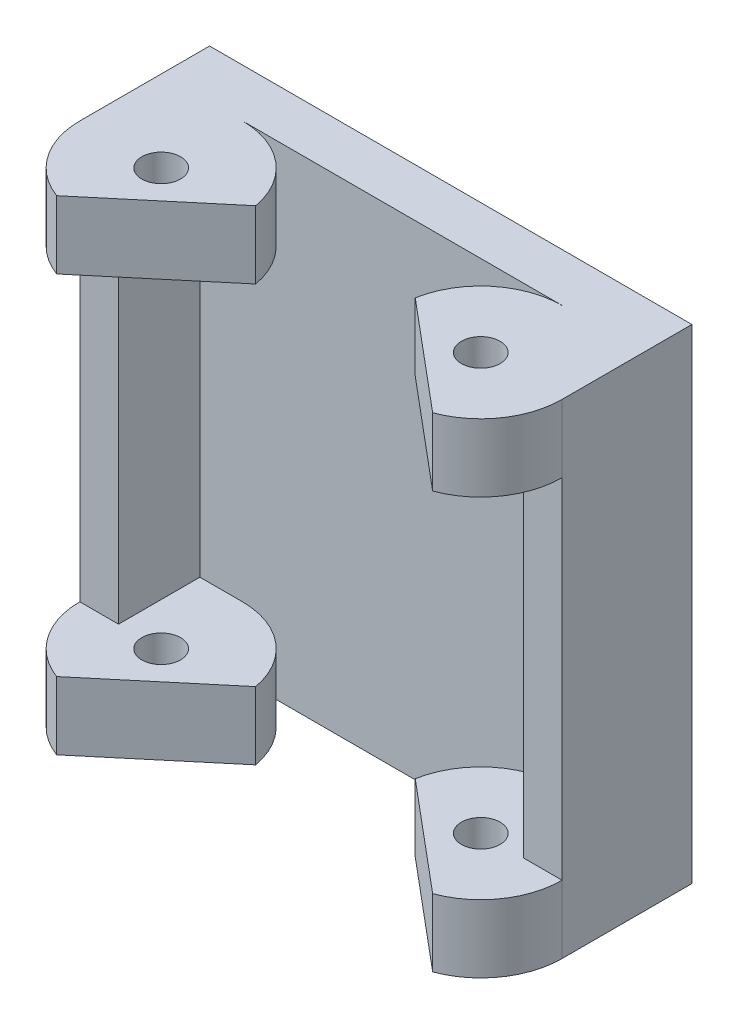
ISO-10303-21;
HEADER;
FILE_DESCRIPTION(('STEP AP214'),'2;1');
FILE_NAME('part.step','',(''),(''),'','','');
FILE_SCHEMA(('AUTOMOTIVE_DESIGN { 1 0 10303 214 1 1 1 1 }'));
ENDSEC;
DATA;
#1=APPLICATION_CONTEXT('core data for automotive mechanical design processes');
#2=APPLICATION_PROTOCOL_DEFINITION('international standard','automotive_design',2000,#1);
#3=PRODUCT_CONTEXT('',#1,'mechanical');
#4=PRODUCT('Part','Part','',(#3));
#5=PRODUCT_RELATED_PRODUCT_CATEGORY('part','',(#4));
#6=PRODUCT_DEFINITION_FORMATION('','',#4);
#7=PRODUCT_DEFINITION_CONTEXT('part definition',#1,'design');
#8=PRODUCT_DEFINITION('design','',#6,#7);
#9=PRODUCT_DEFINITION_SHAPE('','',#8);
#10=(LENGTH_UNIT() NAMED_UNIT(*) SI_UNIT(.MILLI.,.METRE.));
#11=(NAMED_UNIT(*) PLANE_ANGLE_UNIT() SI_UNIT($,.RADIAN.));
#12=(NAMED_UNIT(*) SI_UNIT($,.STERADIAN.) SOLID_ANGLE_UNIT());
#13=UNCERTAINTY_MEASURE_WITH_UNIT(LENGTH_MEASURE(1.E-05),#10,'distance_accuracy_value','');
#14=(GEOMETRIC_REPRESENTATION_CONTEXT(3) GLOBAL_UNCERTAINTY_ASSIGNED_CONTEXT((#13)) GLOBAL_UNIT_ASSIGNED_CONTEXT((#10,
#11,#12)) REPRESENTATION_CONTEXT('',''));
#15=CARTESIAN_POINT('',(0.,0.,0.));
#16=DIRECTION('',(0.,0.,1.));
#17=DIRECTION('',(1.,0.,0.));
#18=AXIS2_PLACEMENT_3D('',#15,#16,#17);
#19=CARTESIAN_POINT('',(-16.5,7.,0.));
#20=DIRECTION('',(0.,-1.,0.));
#21=DIRECTION('',(0.,0.,-1.));
#22=AXIS2_PLACEMENT_3D('',#19,#20,#21);
#23=PLANE('',#22);
#24=CARTESIAN_POINT('',(16.5,7.,0.));
#25=DIRECTION('',(0.,-1.,0.));
#26=DIRECTION('',(0.,0.,-1.));
#27=AXIS2_PLACEMENT_3D('',#24,#25,#26);
#28=CIRCLE('',#27,2.);
#29=CARTESIAN_POINT('',(16.5,7.,-2.));
#30=VERTEX_POINT('',#29);
#31=EDGE_CURVE('E294',#30,#30,#28,.T.);
#32=ORIENTED_EDGE('',*,*,#31,.T.);
#33=EDGE_LOOP('',(#32));
#34=FACE_BOUND('',#33,.T.);
#35=DIRECTION('',(1.,0.,0.));
#36=VECTOR('',#35,1.);
#37=CARTESIAN_POINT('',(20.9,7.,0.));
#38=LINE('',#37,#36);
#39=CARTESIAN_POINT('',(20.9,7.,0.));
#40=VERTEX_POINT('',#39);
#41=CARTESIAN_POINT('',(24.9,7.,0.));
#42=VERTEX_POINT('',#41);
#43=EDGE_CURVE('E240',#40,#42,#38,.T.);
#44=ORIENTED_EDGE('',*,*,#43,.F.);
#45=DIRECTION('',(0.,0.,1.));
#46=VECTOR('',#45,1.);
#47=CARTESIAN_POINT('',(20.9,7.,-8.4));
#48=LINE('',#47,#46);
#49=CARTESIAN_POINT('',(20.9,7.,-8.4));
#50=VERTEX_POINT('',#49);
#51=EDGE_CURVE('E259',#50,#40,#48,.T.);
#52=ORIENTED_EDGE('',*,*,#51,.F.);
#53=DIRECTION('',(1.,0.,0.));
#54=VECTOR('',#53,1.);
#55=CARTESIAN_POINT('',(16.5,7.,-8.4));
#56=LINE('',#55,#54);
#57=CARTESIAN_POINT('',(16.5,7.,-8.4));
#58=VERTEX_POINT('',#57);
#59=EDGE_CURVE('E11',#58,#50,#56,.T.);
#60=ORIENTED_EDGE('',*,*,#59,.F.);
#61=CARTESIAN_POINT('',(16.5,7.,0.));
#62=DIRECTION('',(0.,1.,0.));
#63=DIRECTION('',(0.,0.,1.));
#64=AXIS2_PLACEMENT_3D('',#61,#62,#63);
#65=CIRCLE('',#64,8.4);
#66=CARTESIAN_POINT('',(8.23501361162645,7.,-1.5));
#67=VERTEX_POINT('',#66);
#68=EDGE_CURVE('E317',#58,#67,#65,.T.);
#69=ORIENTED_EDGE('',*,*,#68,.T.);
#70=DIRECTION('',(0.766044443118975,0.,0.642787609686543));
#71=VECTOR('',#70,1.);
#72=CARTESIAN_POINT('',(19.4124114543013,7.,7.87895040731026));
#73=LINE('',#72,#71);
#74=CARTESIAN_POINT('',(19.4124114543013,7.,7.87895040731027));
#75=VERTEX_POINT('',#74);
#76=EDGE_CURVE('E320',#67,#75,#73,.T.);
#77=ORIENTED_EDGE('',*,*,#76,.T.);
#78=CARTESIAN_POINT('',(16.5,7.,0.));
#79=DIRECTION('',(0.,1.,0.));
#80=DIRECTION('',(0.,0.,1.));
#81=AXIS2_PLACEMENT_3D('',#78,#79,#80);
#82=CIRCLE('',#81,8.4);
#83=EDGE_CURVE('E323',#75,#42,#82,.T.);
#84=ORIENTED_EDGE('',*,*,#83,.T.);
#85=EDGE_LOOP('',(#44,#52,#60,#69,#77,#84));
#86=FACE_BOUND('',#85,.T.);
#87=ADVANCED_FACE('F39',(#34,#86),#23,.F.);
#88=CARTESIAN_POINT('',(-16.5,7.,0.));
#89=DIRECTION('',(0.,-1.,0.));
#90=DIRECTION('',(0.,0.,-1.));
#91=AXIS2_PLACEMENT_3D('',#88,#89,#90);
#92=CIRCLE('',#91,2.);
#93=CARTESIAN_POINT('',(-16.5,7.,-2.));
#94=VERTEX_POINT('',#93);
#95=EDGE_CURVE('E301',#94,#94,#92,.T.);
#96=ORIENTED_EDGE('',*,*,#95,.T.);
#97=EDGE_LOOP('',(#96));
#98=FACE_BOUND('',#97,.T.);
#99=CARTESIAN_POINT('',(-20.9,7.,-8.39999999999999));
#100=VERTEX_POINT('',#99);
#101=CARTESIAN_POINT('',(-16.5,7.,-8.4));
#102=VERTEX_POINT('',#101);
#103=EDGE_CURVE('E50',#100,#102,#56,.T.);
#104=ORIENTED_EDGE('',*,*,#103,.F.);
#105=DIRECTION('',(0.,0.,-1.));
#106=VECTOR('',#105,1.);
#107=CARTESIAN_POINT('',(-20.9,7.,-8.39999999999999));
#108=LINE('',#107,#106);
#109=CARTESIAN_POINT('',(-20.9,7.,0.));
#110=VERTEX_POINT('',#109);
#111=EDGE_CURVE('E229',#110,#100,#108,.T.);
#112=ORIENTED_EDGE('',*,*,#111,.F.);
#113=DIRECTION('',(1.,0.,0.));
#114=VECTOR('',#113,1.);
#115=CARTESIAN_POINT('',(-20.9,7.,0.));
#116=LINE('',#115,#114);
#117=CARTESIAN_POINT('',(-24.9,7.,0.));
#118=VERTEX_POINT('',#117);
#119=EDGE_CURVE('E224',#118,#110,#116,.T.);
#120=ORIENTED_EDGE('',*,*,#119,.F.);
#121=CARTESIAN_POINT('',(-16.5,7.,0.));
#122=DIRECTION('',(0.,1.,0.));
#123=DIRECTION('',(0.,0.,-1.));
#124=AXIS2_PLACEMENT_3D('',#121,#122,#123);
#125=CIRCLE('',#124,8.4);
#126=CARTESIAN_POINT('',(-19.4124114543013,7.,7.87895040731027));
#127=VERTEX_POINT('',#126);
#128=EDGE_CURVE('E306',#118,#127,#125,.T.);
#129=ORIENTED_EDGE('',*,*,#128,.T.);
#130=DIRECTION('',(0.766044443118975,0.,-0.642787609686543));
#131=VECTOR('',#130,1.);
#132=CARTESIAN_POINT('',(-19.4124114543013,7.,7.87895040731027));
#133=LINE('',#132,#131);
#134=CARTESIAN_POINT('',(-8.23501361162645,7.,-1.5));
#135=VERTEX_POINT('',#134);
#136=EDGE_CURVE('E310',#127,#135,#133,.T.);
#137=ORIENTED_EDGE('',*,*,#136,.T.);
#138=CARTESIAN_POINT('',(-16.5,7.,0.));
#139=DIRECTION('',(0.,1.,0.));
#140=DIRECTION('',(0.,0.,-1.));
#141=AXIS2_PLACEMENT_3D('',#138,#139,#140);
#142=CIRCLE('',#141,8.4);
#143=EDGE_CURVE('E314',#135,#102,#142,.T.);
#144=ORIENTED_EDGE('',*,*,#143,.T.);
#145=EDGE_LOOP('',(#104,#112,#120,#129,#137,#144));
#146=FACE_BOUND('',#145,.T.);
#147=ADVANCED_FACE('F413',(#98,#146),#23,.F.);
#148=CARTESIAN_POINT('',(-16.5,7.,0.));
#149=DIRECTION('',(0.,-1.,0.));
#150=DIRECTION('',(0.,0.,-1.));
#151=AXIS2_PLACEMENT_3D('',#148,#149,#150);
#152=CYLINDRICAL_SURFACE('',#151,8.4);
#153=CARTESIAN_POINT('',(-16.5,0.,0.));
#154=DIRECTION('',(0.,1.,0.));
#155=DIRECTION('',(0.,0.,-1.));
#156=AXIS2_PLACEMENT_3D('',#153,#154,#155);
#157=CIRCLE('',#156,8.4);
#158=CARTESIAN_POINT('',(-24.9,0.,0.));
#159=VERTEX_POINT('',#158);
#160=CARTESIAN_POINT('',(-19.4124114543013,0.,7.87895040731027));
#161=VERTEX_POINT('',#160);
#162=EDGE_CURVE('E305',#159,#161,#157,.T.);
#163=ORIENTED_EDGE('',*,*,#162,.T.);
#164=DIRECTION('',(0.,-1.,0.));
#165=VECTOR('',#164,1.);
#166=CARTESIAN_POINT('',(-19.4124114543013,7.,7.87895040731027));
#167=LINE('',#166,#165);
#168=EDGE_CURVE('E43',#127,#161,#167,.T.);
#169=ORIENTED_EDGE('',*,*,#168,.F.);
#170=ORIENTED_EDGE('',*,*,#128,.F.);
#171=DIRECTION('',(0.,-1.,0.));
#172=VECTOR('',#171,1.);
#173=CARTESIAN_POINT('',(-24.9,7.,0.));
#174=LINE('',#173,#172);
#175=EDGE_CURVE('E326',#118,#159,#174,.T.);
#176=ORIENTED_EDGE('',*,*,#175,.T.);
#177=EDGE_LOOP('',(#163,#169,#170,#176));
#178=FACE_BOUND('',#177,.T.);
#179=ADVANCED_FACE('F41',(#178),#152,.T.);
#180=CARTESIAN_POINT('',(-19.4124114543013,7.,7.87895040731027));
#181=DIRECTION('',(-0.642787609686543,0.,-0.766044443118975));
#182=DIRECTION('',(-0.766044443118975,0.,0.642787609686543));
#183=AXIS2_PLACEMENT_3D('',#180,#181,#182);
#184=PLANE('',#183);
#185=DIRECTION('',(0.766044443118975,0.,-0.642787609686543));
#186=VECTOR('',#185,1.);
#187=CARTESIAN_POINT('',(-19.4124114543013,0.,7.87895040731027));
#188=LINE('',#187,#186);
#189=CARTESIAN_POINT('',(-8.23501361162645,0.,-1.5));
#190=VERTEX_POINT('',#189);
#191=EDGE_CURVE('E330',#161,#190,#188,.T.);
#192=ORIENTED_EDGE('',*,*,#191,.T.);
#193=DIRECTION('',(0.,-1.,0.));
#194=VECTOR('',#193,1.);
#195=CARTESIAN_POINT('',(-8.23501361162645,7.,-1.5));
#196=LINE('',#195,#194);
#197=EDGE_CURVE('E386',#135,#190,#196,.T.);
#198=ORIENTED_EDGE('',*,*,#197,.F.);
#199=ORIENTED_EDGE('',*,*,#136,.F.);
#200=ORIENTED_EDGE('',*,*,#168,.T.);
#201=EDGE_LOOP('',(#192,#198,#199,#200));
#202=FACE_BOUND('',#201,.T.);
#203=ADVANCED_FACE('F397',(#202),#184,.F.);
#204=CARTESIAN_POINT('',(-16.5,7.,0.));
#205=DIRECTION('',(0.,-1.,0.));
#206=DIRECTION('',(0.,0.,-1.));
#207=AXIS2_PLACEMENT_3D('',#204,#205,#206);
#208=CYLINDRICAL_SURFACE('',#207,8.4);
#209=CARTESIAN_POINT('',(-16.5,0.,0.));
#210=DIRECTION('',(0.,1.,0.));
#211=DIRECTION('',(0.,0.,-1.));
#212=AXIS2_PLACEMENT_3D('',#209,#210,#211);
#213=CIRCLE('',#212,8.4);
#214=CARTESIAN_POINT('',(-16.5,0.,-8.4));
#215=VERTEX_POINT('',#214);
#216=EDGE_CURVE('E333',#190,#215,#213,.T.);
#217=ORIENTED_EDGE('',*,*,#216,.T.);
#218=DIRECTION('',(0.,-1.,0.));
#219=VECTOR('',#218,1.);
#220=CARTESIAN_POINT('',(-16.5,7.,-8.4));
#221=LINE('',#220,#219);
#222=EDGE_CURVE('E383',#102,#215,#221,.T.);
#223=ORIENTED_EDGE('',*,*,#222,.F.);
#224=ORIENTED_EDGE('',*,*,#143,.F.);
#225=ORIENTED_EDGE('',*,*,#197,.T.);
#226=EDGE_LOOP('',(#217,#223,#224,#225));
#227=FACE_BOUND('',#226,.T.);
#228=ADVANCED_FACE('F409',(#227),#208,.T.);
#229=CARTESIAN_POINT('',(16.5,7.,-8.4));
#230=DIRECTION('',(0.,0.,-1.));
#231=DIRECTION('',(-1.,0.,0.));
#232=AXIS2_PLACEMENT_3D('',#229,#230,#231);
#233=PLANE('',#232);
#234=DIRECTION('',(1.,0.,0.));
#235=VECTOR('',#234,1.);
#236=CARTESIAN_POINT('',(16.5,0.,-8.4));
#237=LINE('',#236,#235);
#238=CARTESIAN_POINT('',(16.5,0.,-8.4));
#239=VERTEX_POINT('',#238);
#240=EDGE_CURVE('E336',#215,#239,#237,.T.);
#241=ORIENTED_EDGE('',*,*,#240,.T.);
#242=DIRECTION('',(0.,-1.,0.));
#243=VECTOR('',#242,1.);
#244=CARTESIAN_POINT('',(16.5,7.,-8.4));
#245=LINE('',#244,#243);
#246=EDGE_CURVE('E379',#58,#239,#245,.T.);
#247=ORIENTED_EDGE('',*,*,#246,.F.);
#248=ORIENTED_EDGE('',*,*,#59,.T.);
#249=DIRECTION('',(0.,-1.,0.));
#250=VECTOR('',#249,1.);
#251=CARTESIAN_POINT('',(20.9,43.,-8.4));
#252=LINE('',#251,#250);
#253=CARTESIAN_POINT('',(20.9,43.,-8.4));
#254=VERTEX_POINT('',#253);
#255=EDGE_CURVE('E273',#254,#50,#252,.T.);
#256=ORIENTED_EDGE('',*,*,#255,.F.);
#257=DIRECTION('',(1.,0.,0.));
#258=VECTOR('',#257,1.);
#259=CARTESIAN_POINT('',(-16.5,43.,-8.4));
#260=LINE('',#259,#258);
#261=CARTESIAN_POINT('',(16.5,43.,-8.40000000000004));
#262=VERTEX_POINT('',#261);
#263=EDGE_CURVE('E57',#262,#254,#260,.T.);
#264=ORIENTED_EDGE('',*,*,#263,.F.);
#265=DIRECTION('',(0.,-1.,0.));
#266=VECTOR('',#265,1.);
#267=CARTESIAN_POINT('',(16.5,50.,-8.4));
#268=LINE('',#267,#266);
#269=CARTESIAN_POINT('',(16.5,50.,-8.4));
#270=VERTEX_POINT('',#269);
#271=EDGE_CURVE('E471',#270,#262,#268,.T.);
#272=ORIENTED_EDGE('',*,*,#271,.F.);
#273=DIRECTION('',(1.,0.,0.));
#274=VECTOR('',#273,1.);
#275=CARTESIAN_POINT('',(-16.5,50.,-8.4));
#276=LINE('',#275,#274);
#277=CARTESIAN_POINT('',(-16.5,50.,-8.4));
#278=VERTEX_POINT('',#277);
#279=EDGE_CURVE('E477',#278,#270,#276,.T.);
#280=ORIENTED_EDGE('',*,*,#279,.F.);
#281=DIRECTION('',(0.,-1.,0.));
#282=VECTOR('',#281,1.);
#283=CARTESIAN_POINT('',(-16.5,50.,-8.4));
#284=LINE('',#283,#282);
#285=CARTESIAN_POINT('',(-16.5,43.,-8.4));
#286=VERTEX_POINT('',#285);
#287=EDGE_CURVE('E231',#278,#286,#284,.T.);
#288=ORIENTED_EDGE('',*,*,#287,.T.);
#289=CARTESIAN_POINT('',(-20.9,43.,-8.39999999999999));
#290=VERTEX_POINT('',#289);
#291=EDGE_CURVE('E65',#290,#286,#260,.T.);
#292=ORIENTED_EDGE('',*,*,#291,.F.);
#293=DIRECTION('',(0.,-1.,0.));
#294=VECTOR('',#293,1.);
#295=CARTESIAN_POINT('',(-20.9,43.,-8.39999999999999));
#296=LINE('',#295,#294);
#297=EDGE_CURVE('E277',#290,#100,#296,.T.);
#298=ORIENTED_EDGE('',*,*,#297,.T.);
#299=ORIENTED_EDGE('',*,*,#103,.T.);
#300=ORIENTED_EDGE('',*,*,#222,.T.);
#301=EDGE_LOOP('',(#241,#247,#248,#256,#264,#272,#280,#288,#292,#298,#299,#300));
#302=FACE_BOUND('',#301,.T.);
#303=ADVANCED_FACE('F410',(#302),#233,.F.);
#304=CARTESIAN_POINT('',(16.5,7.,0.));
#305=DIRECTION('',(0.,-1.,0.));
#306=DIRECTION('',(0.,0.,-1.));
#307=AXIS2_PLACEMENT_3D('',#304,#305,#306);
#308=CYLINDRICAL_SURFACE('',#307,8.4);
#309=CARTESIAN_POINT('',(16.5,0.,0.));
#310=DIRECTION('',(0.,1.,0.));
#311=DIRECTION('',(0.,0.,1.));
#312=AXIS2_PLACEMENT_3D('',#309,#310,#311);
#313=CIRCLE('',#312,8.4);
#314=CARTESIAN_POINT('',(8.23501361162645,0.,-1.5));
#315=VERTEX_POINT('',#314);
#316=EDGE_CURVE('E339',#239,#315,#313,.T.);
#317=ORIENTED_EDGE('',*,*,#316,.T.);
#318=DIRECTION('',(0.,-1.,0.));
#319=VECTOR('',#318,1.);
#320=CARTESIAN_POINT('',(8.23501361162645,7.,-1.5));
#321=LINE('',#320,#319);
#322=EDGE_CURVE('E375',#67,#315,#321,.T.);
#323=ORIENTED_EDGE('',*,*,#322,.F.);
#324=ORIENTED_EDGE('',*,*,#68,.F.);
#325=ORIENTED_EDGE('',*,*,#246,.T.);
#326=EDGE_LOOP('',(#317,#323,#324,#325));
#327=FACE_BOUND('',#326,.T.);
#328=ADVANCED_FACE('F529',(#327),#308,.T.);
#329=CARTESIAN_POINT('',(19.4124114543013,7.,7.87895040731026));
#330=DIRECTION('',(0.642787609686543,0.,-0.766044443118975));
#331=DIRECTION('',(-0.766044443118975,0.,-0.642787609686543));
#332=AXIS2_PLACEMENT_3D('',#329,#330,#331);
#333=PLANE('',#332);
#334=DIRECTION('',(0.766044443118975,0.,0.642787609686543));
#335=VECTOR('',#334,1.);
#336=CARTESIAN_POINT('',(19.4124114543013,0.,7.87895040731026));
#337=LINE('',#336,#335);
#338=CARTESIAN_POINT('',(19.4124114543013,0.,7.87895040731027));
#339=VERTEX_POINT('',#338);
#340=EDGE_CURVE('E342',#315,#339,#337,.T.);
#341=ORIENTED_EDGE('',*,*,#340,.T.);
#342=DIRECTION('',(0.,-1.,0.));
#343=VECTOR('',#342,1.);
#344=CARTESIAN_POINT('',(19.4124114543013,7.,7.87895040731027));
#345=LINE('',#344,#343);
#346=EDGE_CURVE('E371',#75,#339,#345,.T.);
#347=ORIENTED_EDGE('',*,*,#346,.F.);
#348=ORIENTED_EDGE('',*,*,#76,.F.);
#349=ORIENTED_EDGE('',*,*,#322,.T.);
#350=EDGE_LOOP('',(#341,#347,#348,#349));
#351=FACE_BOUND('',#350,.T.);
#352=ADVANCED_FACE('F525',(#351),#333,.F.);
#353=CARTESIAN_POINT('',(16.5,7.,0.));
#354=DIRECTION('',(0.,-1.,0.));
#355=DIRECTION('',(0.,0.,-1.));
#356=AXIS2_PLACEMENT_3D('',#353,#354,#355);
#357=CYLINDRICAL_SURFACE('',#356,8.4);
#358=CARTESIAN_POINT('',(16.5,0.,0.));
#359=DIRECTION('',(0.,1.,0.));
#360=DIRECTION('',(0.,0.,1.));
#361=AXIS2_PLACEMENT_3D('',#358,#359,#360);
#362=CIRCLE('',#361,8.4);
#363=CARTESIAN_POINT('',(24.9,0.,0.));
#364=VERTEX_POINT('',#363);
#365=EDGE_CURVE('E345',#339,#364,#362,.T.);
#366=ORIENTED_EDGE('',*,*,#365,.T.);
#367=DIRECTION('',(0.,-1.,0.));
#368=VECTOR('',#367,1.);
#369=CARTESIAN_POINT('',(24.9,7.,0.));
#370=LINE('',#369,#368);
#371=EDGE_CURVE('E367',#42,#364,#370,.T.);
#372=ORIENTED_EDGE('',*,*,#371,.F.);
#373=ORIENTED_EDGE('',*,*,#83,.F.);
#374=ORIENTED_EDGE('',*,*,#346,.T.);
#375=EDGE_LOOP('',(#366,#372,#373,#374));
#376=FACE_BOUND('',#375,.T.);
#377=ADVANCED_FACE('F521',(#376),#357,.T.);
#378=CARTESIAN_POINT('',(24.9,7.,0.));
#379=DIRECTION('',(-1.,0.,0.));
#380=DIRECTION('',(0.,0.,1.));
#381=AXIS2_PLACEMENT_3D('',#378,#379,#380);
#382=PLANE('',#381);
#383=DIRECTION('',(0.,0.,-1.));
#384=VECTOR('',#383,1.);
#385=CARTESIAN_POINT('',(24.9,0.,0.));
#386=LINE('',#385,#384);
#387=CARTESIAN_POINT('',(24.9,0.,-13.4));
#388=VERTEX_POINT('',#387);
#389=EDGE_CURVE('E348',#364,#388,#386,.T.);
#390=ORIENTED_EDGE('',*,*,#389,.T.);
#391=DIRECTION('',(0.,-1.,0.));
#392=VECTOR('',#391,1.);
#393=CARTESIAN_POINT('',(24.9,7.,-13.4));
#394=LINE('',#393,#392);
#395=CARTESIAN_POINT('',(24.9,50.,-13.4));
#396=VERTEX_POINT('',#395);
#397=EDGE_CURVE('E363',#396,#388,#394,.T.);
#398=ORIENTED_EDGE('',*,*,#397,.F.);
#399=DIRECTION('',(0.,0.,-1.));
#400=VECTOR('',#399,1.);
#401=CARTESIAN_POINT('',(24.9,50.,0.));
#402=LINE('',#401,#400);
#403=CARTESIAN_POINT('',(24.9,50.,0.));
#404=VERTEX_POINT('',#403);
#405=EDGE_CURVE('E428',#404,#396,#402,.T.);
#406=ORIENTED_EDGE('',*,*,#405,.F.);
#407=DIRECTION('',(0.,-1.,0.));
#408=VECTOR('',#407,1.);
#409=CARTESIAN_POINT('',(24.9,50.,0.));
#410=LINE('',#409,#408);
#411=CARTESIAN_POINT('',(24.9,43.,0.));
#412=VERTEX_POINT('',#411);
#413=EDGE_CURVE('E459',#404,#412,#410,.T.);
#414=ORIENTED_EDGE('',*,*,#413,.T.);
#415=DIRECTION('',(0.,-1.,0.));
#416=VECTOR('',#415,1.);
#417=CARTESIAN_POINT('',(24.9,43.,0.));
#418=LINE('',#417,#416);
#419=EDGE_CURVE('E252',#412,#42,#418,.T.);
#420=ORIENTED_EDGE('',*,*,#419,.T.);
#421=ORIENTED_EDGE('',*,*,#371,.T.);
#422=EDGE_LOOP('',(#390,#398,#406,#414,#420,#421));
#423=FACE_BOUND('',#422,.T.);
#424=ADVANCED_FACE('F518',(#423),#382,.F.);
#425=CARTESIAN_POINT('',(-24.9,7.,-13.4));
#426=DIRECTION('',(0.,0.,1.));
#427=DIRECTION('',(1.,0.,0.));
#428=AXIS2_PLACEMENT_3D('',#425,#426,#427);
#429=PLANE('',#428);
#430=DIRECTION('',(-1.,0.,0.));
#431=VECTOR('',#430,1.);
#432=CARTESIAN_POINT('',(-24.9,0.,-13.4));
#433=LINE('',#432,#431);
#434=CARTESIAN_POINT('',(-24.9,0.,-13.4));
#435=VERTEX_POINT('',#434);
#436=EDGE_CURVE('E351',#388,#435,#433,.T.);
#437=ORIENTED_EDGE('',*,*,#436,.T.);
#438=DIRECTION('',(0.,-1.,0.));
#439=VECTOR('',#438,1.);
#440=CARTESIAN_POINT('',(-24.9,7.,-13.4));
#441=LINE('',#440,#439);
#442=CARTESIAN_POINT('',(-24.9,50.,-13.4));
#443=VERTEX_POINT('',#442);
#444=EDGE_CURVE('E359',#443,#435,#441,.T.);
#445=ORIENTED_EDGE('',*,*,#444,.F.);
#446=DIRECTION('',(-1.,0.,0.));
#447=VECTOR('',#446,1.);
#448=CARTESIAN_POINT('',(24.9,50.,-13.4));
#449=LINE('',#448,#447);
#450=EDGE_CURVE('E425',#396,#443,#449,.T.);
#451=ORIENTED_EDGE('',*,*,#450,.F.);
#452=ORIENTED_EDGE('',*,*,#397,.T.);
#453=EDGE_LOOP('',(#437,#445,#451,#452));
#454=FACE_BOUND('',#453,.T.);
#455=ADVANCED_FACE('F424',(#454),#429,.F.);
#456=CARTESIAN_POINT('',(-24.9,7.,0.));
#457=DIRECTION('',(1.,0.,0.));
#458=DIRECTION('',(0.,0.,-1.));
#459=AXIS2_PLACEMENT_3D('',#456,#457,#458);
#460=PLANE('',#459);
#461=DIRECTION('',(0.,0.,1.));
#462=VECTOR('',#461,1.);
#463=CARTESIAN_POINT('',(-24.9,0.,0.));
#464=LINE('',#463,#462);
#465=EDGE_CURVE('E311',#435,#159,#464,.T.);
#466=ORIENTED_EDGE('',*,*,#465,.T.);
#467=ORIENTED_EDGE('',*,*,#175,.F.);
#468=DIRECTION('',(0.,-1.,0.));
#469=VECTOR('',#468,1.);
#470=CARTESIAN_POINT('',(-24.9,43.,0.));
#471=LINE('',#470,#469);
#472=CARTESIAN_POINT('',(-24.9,43.,0.));
#473=VERTEX_POINT('',#472);
#474=EDGE_CURVE('E285',#473,#118,#471,.T.);
#475=ORIENTED_EDGE('',*,*,#474,.F.);
#476=DIRECTION('',(0.,-1.,0.));
#477=VECTOR('',#476,1.);
#478=CARTESIAN_POINT('',(-24.9,50.,0.));
#479=LINE('',#478,#477);
#480=CARTESIAN_POINT('',(-24.9,50.,0.));
#481=VERTEX_POINT('',#480);
#482=EDGE_CURVE('E433',#481,#473,#479,.T.);
#483=ORIENTED_EDGE('',*,*,#482,.F.);
#484=DIRECTION('',(0.,0.,1.));
#485=VECTOR('',#484,1.);
#486=CARTESIAN_POINT('',(-24.9,50.,-13.4));
#487=LINE('',#486,#485);
#488=EDGE_CURVE('E213',#443,#481,#487,.T.);
#489=ORIENTED_EDGE('',*,*,#488,.F.);
#490=ORIENTED_EDGE('',*,*,#444,.T.);
#491=EDGE_LOOP('',(#466,#467,#475,#483,#489,#490));
#492=FACE_BOUND('',#491,.T.);
#493=ADVANCED_FACE('F421',(#492),#460,.F.);
#494=CARTESIAN_POINT('',(-16.5,0.,0.));
#495=DIRECTION('',(0.,-1.,0.));
#496=DIRECTION('',(0.,0.,-1.));
#497=AXIS2_PLACEMENT_3D('',#494,#495,#496);
#498=PLANE('',#497);
#499=CARTESIAN_POINT('',(-16.5,0.,0.));
#500=DIRECTION('',(0.,1.,0.));
#501=DIRECTION('',(0.,0.,1.));
#502=AXIS2_PLACEMENT_3D('',#499,#500,#501);
#503=CIRCLE('',#502,2.);
#504=CARTESIAN_POINT('',(-16.5,0.,2.));
#505=VERTEX_POINT('',#504);
#506=EDGE_CURVE('E290',#505,#505,#503,.T.);
#507=ORIENTED_EDGE('',*,*,#506,.T.);
#508=EDGE_LOOP('',(#507));
#509=FACE_BOUND('',#508,.T.);
#510=CARTESIAN_POINT('',(16.5,0.,0.));
#511=DIRECTION('',(0.,1.,0.));
#512=DIRECTION('',(0.,0.,1.));
#513=AXIS2_PLACEMENT_3D('',#510,#511,#512);
#514=CIRCLE('',#513,2.);
#515=CARTESIAN_POINT('',(16.5,0.,2.));
#516=VERTEX_POINT('',#515);
#517=EDGE_CURVE('E289',#516,#516,#514,.T.);
#518=ORIENTED_EDGE('',*,*,#517,.T.);
#519=EDGE_LOOP('',(#518));
#520=FACE_BOUND('',#519,.T.);
#521=ORIENTED_EDGE('',*,*,#162,.F.);
#522=ORIENTED_EDGE('',*,*,#465,.F.);
#523=ORIENTED_EDGE('',*,*,#436,.F.);
#524=ORIENTED_EDGE('',*,*,#389,.F.);
#525=ORIENTED_EDGE('',*,*,#365,.F.);
#526=ORIENTED_EDGE('',*,*,#340,.F.);
#527=ORIENTED_EDGE('',*,*,#316,.F.);
#528=ORIENTED_EDGE('',*,*,#240,.F.);
#529=ORIENTED_EDGE('',*,*,#216,.F.);
#530=ORIENTED_EDGE('',*,*,#191,.F.);
#531=EDGE_LOOP('',(#521,#522,#523,#524,#525,#526,#527,#528,#529,#530));
#532=FACE_BOUND('',#531,.T.);
#533=ADVANCED_FACE('F404',(#509,#520,#532),#498,.T.);
#534=CARTESIAN_POINT('',(16.5,0.,0.));
#535=DIRECTION('',(0.,1.,0.));
#536=DIRECTION('',(0.,0.,1.));
#537=AXIS2_PLACEMENT_3D('',#534,#535,#536);
#538=CYLINDRICAL_SURFACE('',#537,2.);
#539=ORIENTED_EDGE('',*,*,#517,.F.);
#540=EDGE_LOOP('',(#539));
#541=FACE_BOUND('',#540,.T.);
#542=ORIENTED_EDGE('',*,*,#31,.F.);
#543=EDGE_LOOP('',(#542));
#544=FACE_BOUND('',#543,.T.);
#545=ADVANCED_FACE('F509',(#541,#544),#538,.F.);
#546=CARTESIAN_POINT('',(-16.5,0.,0.));
#547=DIRECTION('',(0.,1.,0.));
#548=DIRECTION('',(0.,0.,1.));
#549=AXIS2_PLACEMENT_3D('',#546,#547,#548);
#550=CYLINDRICAL_SURFACE('',#549,2.);
#551=ORIENTED_EDGE('',*,*,#506,.F.);
#552=EDGE_LOOP('',(#551));
#553=FACE_BOUND('',#552,.T.);
#554=ORIENTED_EDGE('',*,*,#95,.F.);
#555=EDGE_LOOP('',(#554));
#556=FACE_BOUND('',#555,.T.);
#557=ADVANCED_FACE('F559',(#553,#556),#550,.F.);
#558=CARTESIAN_POINT('',(-20.9,43.,0.));
#559=DIRECTION('',(0.,0.,-1.));
#560=DIRECTION('',(-1.,0.,0.));
#561=AXIS2_PLACEMENT_3D('',#558,#559,#560);
#562=PLANE('',#561);
#563=ORIENTED_EDGE('',*,*,#119,.T.);
#564=DIRECTION('',(0.,-1.,0.));
#565=VECTOR('',#564,1.);
#566=CARTESIAN_POINT('',(-20.9,43.,0.));
#567=LINE('',#566,#565);
#568=CARTESIAN_POINT('',(-20.9,43.,0.));
#569=VERTEX_POINT('',#568);
#570=EDGE_CURVE('E281',#569,#110,#567,.T.);
#571=ORIENTED_EDGE('',*,*,#570,.F.);
#572=DIRECTION('',(1.,0.,0.));
#573=VECTOR('',#572,1.);
#574=CARTESIAN_POINT('',(-20.9,43.,0.));
#575=LINE('',#574,#573);
#576=EDGE_CURVE('E235',#473,#569,#575,.T.);
#577=ORIENTED_EDGE('',*,*,#576,.F.);
#578=ORIENTED_EDGE('',*,*,#474,.T.);
#579=EDGE_LOOP('',(#563,#571,#577,#578));
#580=FACE_BOUND('',#579,.T.);
#581=ADVANCED_FACE('F419',(#580),#562,.F.);
#582=CARTESIAN_POINT('',(-20.9,43.,-8.39999999999999));
#583=DIRECTION('',(-1.,0.,0.));
#584=DIRECTION('',(0.,0.,1.));
#585=AXIS2_PLACEMENT_3D('',#582,#583,#584);
#586=PLANE('',#585);
#587=ORIENTED_EDGE('',*,*,#111,.T.);
#588=ORIENTED_EDGE('',*,*,#297,.F.);
#589=DIRECTION('',(0.,0.,-1.));
#590=VECTOR('',#589,1.);
#591=CARTESIAN_POINT('',(-20.9,43.,-8.39999999999999));
#592=LINE('',#591,#590);
#593=EDGE_CURVE('E239',#569,#290,#592,.T.);
#594=ORIENTED_EDGE('',*,*,#593,.F.);
#595=ORIENTED_EDGE('',*,*,#570,.T.);
#596=EDGE_LOOP('',(#587,#588,#594,#595));
#597=FACE_BOUND('',#596,.T.);
#598=ADVANCED_FACE('F415',(#597),#586,.F.);
#599=CARTESIAN_POINT('',(20.9,43.,-8.4));
#600=DIRECTION('',(1.,0.,0.));
#601=DIRECTION('',(0.,0.,-1.));
#602=AXIS2_PLACEMENT_3D('',#599,#600,#601);
#603=PLANE('',#602);
#604=ORIENTED_EDGE('',*,*,#51,.T.);
#605=DIRECTION('',(0.,-1.,0.));
#606=VECTOR('',#605,1.);
#607=CARTESIAN_POINT('',(20.9,43.,0.));
#608=LINE('',#607,#606);
#609=CARTESIAN_POINT('',(20.9,43.,0.));
#610=VERTEX_POINT('',#609);
#611=EDGE_CURVE('E269',#610,#40,#608,.T.);
#612=ORIENTED_EDGE('',*,*,#611,.F.);
#613=DIRECTION('',(0.,0.,1.));
#614=VECTOR('',#613,1.);
#615=CARTESIAN_POINT('',(20.9,43.,-8.4));
#616=LINE('',#615,#614);
#617=EDGE_CURVE('E245',#254,#610,#616,.T.);
#618=ORIENTED_EDGE('',*,*,#617,.F.);
#619=ORIENTED_EDGE('',*,*,#255,.T.);
#620=EDGE_LOOP('',(#604,#612,#618,#619));
#621=FACE_BOUND('',#620,.T.);
#622=ADVANCED_FACE('F492',(#621),#603,.F.);
#623=CARTESIAN_POINT('',(20.9,43.,0.));
#624=DIRECTION('',(0.,0.,-1.));
#625=DIRECTION('',(-1.,0.,0.));
#626=AXIS2_PLACEMENT_3D('',#623,#624,#625);
#627=PLANE('',#626);
#628=ORIENTED_EDGE('',*,*,#43,.T.);
#629=ORIENTED_EDGE('',*,*,#419,.F.);
#630=DIRECTION('',(1.,0.,0.));
#631=VECTOR('',#630,1.);
#632=CARTESIAN_POINT('',(20.9,43.,0.));
#633=LINE('',#632,#631);
#634=EDGE_CURVE('E249',#610,#412,#633,.T.);
#635=ORIENTED_EDGE('',*,*,#634,.F.);
#636=ORIENTED_EDGE('',*,*,#611,.T.);
#637=EDGE_LOOP('',(#628,#629,#635,#636));
#638=FACE_BOUND('',#637,.T.);
#639=ADVANCED_FACE('F482',(#638),#627,.F.);
#640=CARTESIAN_POINT('',(-16.5,43.,0.));
#641=DIRECTION('',(0.,1.,0.));
#642=DIRECTION('',(0.,0.,1.));
#643=AXIS2_PLACEMENT_3D('',#640,#641,#642);
#644=PLANE('',#643);
#645=CARTESIAN_POINT('',(-16.5,43.,0.));
#646=DIRECTION('',(0.,1.,0.));
#647=DIRECTION('',(0.,0.,1.));
#648=AXIS2_PLACEMENT_3D('',#645,#646,#647);
#649=CIRCLE('',#648,2.);
#650=CARTESIAN_POINT('',(-16.5,43.,2.));
#651=VERTEX_POINT('',#650);
#652=EDGE_CURVE('E775',#651,#651,#649,.T.);
#653=ORIENTED_EDGE('',*,*,#652,.T.);
#654=EDGE_LOOP('',(#653));
#655=FACE_BOUND('',#654,.T.);
#656=CARTESIAN_POINT('',(-16.5,43.,0.));
#657=DIRECTION('',(0.,1.,0.));
#658=DIRECTION('',(0.,0.,1.));
#659=AXIS2_PLACEMENT_3D('',#656,#657,#658);
#660=CIRCLE('',#659,8.4);
#661=CARTESIAN_POINT('',(-19.4124114543013,43.,7.87895040731027));
#662=VERTEX_POINT('',#661);
#663=EDGE_CURVE('E222',#473,#662,#660,.T.);
#664=ORIENTED_EDGE('',*,*,#663,.F.);
#665=ORIENTED_EDGE('',*,*,#576,.T.);
#666=ORIENTED_EDGE('',*,*,#593,.T.);
#667=ORIENTED_EDGE('',*,*,#291,.T.);
#668=CARTESIAN_POINT('',(-16.5,43.,0.));
#669=DIRECTION('',(0.,1.,0.));
#670=DIRECTION('',(0.,0.,1.));
#671=AXIS2_PLACEMENT_3D('',#668,#669,#670);
#672=CIRCLE('',#671,8.4);
#673=CARTESIAN_POINT('',(-8.23501361162645,43.,-1.5));
#674=VERTEX_POINT('',#673);
#675=EDGE_CURVE('E445',#674,#286,#672,.T.);
#676=ORIENTED_EDGE('',*,*,#675,.F.);
#677=DIRECTION('',(0.766044443118975,0.,-0.642787609686544));
#678=VECTOR('',#677,1.);
#679=CARTESIAN_POINT('',(-19.4124114543013,43.,7.87895040731027));
#680=LINE('',#679,#678);
#681=EDGE_CURVE('E441',#662,#674,#680,.T.);
#682=ORIENTED_EDGE('',*,*,#681,.F.);
#683=EDGE_LOOP('',(#664,#665,#666,#667,#676,#682));
#684=FACE_BOUND('',#683,.T.);
#685=ADVANCED_FACE('F480',(#655,#684),#644,.F.);
#686=CARTESIAN_POINT('',(-16.5,50.,0.));
#687=DIRECTION('',(0.,1.,0.));
#688=DIRECTION('',(0.,0.,1.));
#689=AXIS2_PLACEMENT_3D('',#686,#687,#688);
#690=PLANE('',#689);
#691=CARTESIAN_POINT('',(-16.5,50.,0.));
#692=DIRECTION('',(0.,1.,0.));
#693=DIRECTION('',(0.,0.,1.));
#694=AXIS2_PLACEMENT_3D('',#691,#692,#693);
#695=CIRCLE('',#694,2.);
#696=CARTESIAN_POINT('',(-16.5,50.,2.));
#697=VERTEX_POINT('',#696);
#698=EDGE_CURVE('E442',#697,#697,#695,.T.);
#699=ORIENTED_EDGE('',*,*,#698,.F.);
#700=EDGE_LOOP('',(#699));
#701=FACE_BOUND('',#700,.T.);
#702=CARTESIAN_POINT('',(-16.5,50.,0.));
#703=DIRECTION('',(0.,1.,0.));
#704=DIRECTION('',(0.,0.,1.));
#705=AXIS2_PLACEMENT_3D('',#702,#703,#704);
#706=CIRCLE('',#705,8.4);
#707=CARTESIAN_POINT('',(-19.4124114543013,50.,7.87895040731027));
#708=VERTEX_POINT('',#707);
#709=EDGE_CURVE('E206',#481,#708,#706,.T.);
#710=ORIENTED_EDGE('',*,*,#709,.T.);
#711=DIRECTION('',(0.766044443118975,0.,-0.642787609686544));
#712=VECTOR('',#711,1.);
#713=CARTESIAN_POINT('',(-19.4124114543013,50.,7.87895040731027));
#714=LINE('',#713,#712);
#715=CARTESIAN_POINT('',(-8.23501361162645,50.,-1.5));
#716=VERTEX_POINT('',#715);
#717=EDGE_CURVE('E194',#708,#716,#714,.T.);
#718=ORIENTED_EDGE('',*,*,#717,.T.);
#719=CARTESIAN_POINT('',(-16.5,50.,0.));
#720=DIRECTION('',(0.,1.,0.));
#721=DIRECTION('',(0.,0.,1.));
#722=AXIS2_PLACEMENT_3D('',#719,#720,#721);
#723=CIRCLE('',#722,8.4);
#724=EDGE_CURVE('E205',#716,#278,#723,.T.);
#725=ORIENTED_EDGE('',*,*,#724,.T.);
#726=ORIENTED_EDGE('',*,*,#279,.T.);
#727=CARTESIAN_POINT('',(16.5,50.,0.));
#728=DIRECTION('',(0.,1.,0.));
#729=DIRECTION('',(0.,0.,1.));
#730=AXIS2_PLACEMENT_3D('',#727,#728,#729);
#731=CIRCLE('',#730,8.4);
#732=CARTESIAN_POINT('',(8.23501361162645,50.,-1.5));
#733=VERTEX_POINT('',#732);
#734=EDGE_CURVE('E787',#270,#733,#731,.T.);
#735=ORIENTED_EDGE('',*,*,#734,.T.);
#736=DIRECTION('',(0.766044443118975,0.,0.642787609686543));
#737=VECTOR('',#736,1.);
#738=CARTESIAN_POINT('',(8.23501361162645,50.,-1.5));
#739=LINE('',#738,#737);
#740=CARTESIAN_POINT('',(19.4124114543013,50.,7.87895040731027));
#741=VERTEX_POINT('',#740);
#742=EDGE_CURVE('E790',#733,#741,#739,.T.);
#743=ORIENTED_EDGE('',*,*,#742,.T.);
#744=CARTESIAN_POINT('',(16.5,50.,0.));
#745=DIRECTION('',(0.,1.,0.));
#746=DIRECTION('',(0.,0.,1.));
#747=AXIS2_PLACEMENT_3D('',#744,#745,#746);
#748=CIRCLE('',#747,8.4);
#749=EDGE_CURVE('E435',#741,#404,#748,.T.);
#750=ORIENTED_EDGE('',*,*,#749,.T.);
#751=ORIENTED_EDGE('',*,*,#405,.T.);
#752=ORIENTED_EDGE('',*,*,#450,.T.);
#753=ORIENTED_EDGE('',*,*,#488,.T.);
#754=EDGE_LOOP('',(#710,#718,#725,#726,#735,#743,#750,#751,#752,#753));
#755=FACE_BOUND('',#754,.T.);
#756=CARTESIAN_POINT('',(16.5,50.,0.));
#757=DIRECTION('',(0.,1.,0.));
#758=DIRECTION('',(0.,0.,1.));
#759=AXIS2_PLACEMENT_3D('',#756,#757,#758);
#760=CIRCLE('',#759,2.);
#761=CARTESIAN_POINT('',(16.5,50.,2.));
#762=VERTEX_POINT('',#761);
#763=EDGE_CURVE('E767',#762,#762,#760,.T.);
#764=ORIENTED_EDGE('',*,*,#763,.F.);
#765=EDGE_LOOP('',(#764));
#766=FACE_BOUND('',#765,.T.);
#767=ADVANCED_FACE('F209',(#701,#755,#766),#690,.T.);
#768=CARTESIAN_POINT('',(16.5,43.,0.));
#769=DIRECTION('',(0.,1.,0.));
#770=DIRECTION('',(0.,0.,1.));
#771=AXIS2_PLACEMENT_3D('',#768,#769,#770);
#772=CIRCLE('',#771,8.4);
#773=CARTESIAN_POINT('',(8.23501361162645,43.,-1.5));
#774=VERTEX_POINT('',#773);
#775=EDGE_CURVE('E448',#262,#774,#772,.T.);
#776=ORIENTED_EDGE('',*,*,#775,.F.);
#777=ORIENTED_EDGE('',*,*,#263,.T.);
#778=ORIENTED_EDGE('',*,*,#617,.T.);
#779=ORIENTED_EDGE('',*,*,#634,.T.);
#780=CARTESIAN_POINT('',(16.5,43.,0.));
#781=DIRECTION('',(0.,1.,0.));
#782=DIRECTION('',(0.,0.,1.));
#783=AXIS2_PLACEMENT_3D('',#780,#781,#782);
#784=CIRCLE('',#783,8.4);
#785=CARTESIAN_POINT('',(19.4124114543013,43.,7.87895040731027));
#786=VERTEX_POINT('',#785);
#787=EDGE_CURVE('E218',#786,#412,#784,.T.);
#788=ORIENTED_EDGE('',*,*,#787,.F.);
#789=DIRECTION('',(0.766044443118975,0.,0.642787609686543));
#790=VECTOR('',#789,1.);
#791=CARTESIAN_POINT('',(8.23501361162645,43.,-1.5));
#792=LINE('',#791,#790);
#793=EDGE_CURVE('E451',#774,#786,#792,.T.);
#794=ORIENTED_EDGE('',*,*,#793,.F.);
#795=EDGE_LOOP('',(#776,#777,#778,#779,#788,#794));
#796=FACE_BOUND('',#795,.T.);
#797=CARTESIAN_POINT('',(16.5,43.,0.));
#798=DIRECTION('',(0.,1.,0.));
#799=DIRECTION('',(0.,0.,1.));
#800=AXIS2_PLACEMENT_3D('',#797,#798,#799);
#801=CIRCLE('',#800,2.);
#802=CARTESIAN_POINT('',(16.5,43.,2.));
#803=VERTEX_POINT('',#802);
#804=EDGE_CURVE('E770',#803,#803,#801,.T.);
#805=ORIENTED_EDGE('',*,*,#804,.T.);
#806=EDGE_LOOP('',(#805));
#807=FACE_BOUND('',#806,.T.);
#808=ADVANCED_FACE('F485',(#796,#807),#644,.F.);
#809=CARTESIAN_POINT('',(-16.5,50.,0.));
#810=DIRECTION('',(0.,-1.,0.));
#811=DIRECTION('',(0.,0.,-1.));
#812=AXIS2_PLACEMENT_3D('',#809,#810,#811);
#813=CYLINDRICAL_SURFACE('',#812,8.4);
#814=ORIENTED_EDGE('',*,*,#663,.T.);
#815=DIRECTION('',(0.,-1.,0.));
#816=VECTOR('',#815,1.);
#817=CARTESIAN_POINT('',(-19.4124114543013,50.,7.87895040731027));
#818=LINE('',#817,#816);
#819=EDGE_CURVE('E198',#708,#662,#818,.T.);
#820=ORIENTED_EDGE('',*,*,#819,.F.);
#821=ORIENTED_EDGE('',*,*,#709,.F.);
#822=ORIENTED_EDGE('',*,*,#482,.T.);
#823=EDGE_LOOP('',(#814,#820,#821,#822));
#824=FACE_BOUND('',#823,.T.);
#825=ADVANCED_FACE('F220',(#824),#813,.T.);
#826=CARTESIAN_POINT('',(-19.4124114543013,50.,7.87895040731027));
#827=DIRECTION('',(-0.642787609686543,0.,-0.766044443118975));
#828=DIRECTION('',(-0.766044443118975,0.,0.642787609686543));
#829=AXIS2_PLACEMENT_3D('',#826,#827,#828);
#830=PLANE('',#829);
#831=ORIENTED_EDGE('',*,*,#681,.T.);
#832=DIRECTION('',(0.,-1.,0.));
#833=VECTOR('',#832,1.);
#834=CARTESIAN_POINT('',(-8.23501361162645,50.,-1.5));
#835=LINE('',#834,#833);
#836=EDGE_CURVE('E201',#716,#674,#835,.T.);
#837=ORIENTED_EDGE('',*,*,#836,.F.);
#838=ORIENTED_EDGE('',*,*,#717,.F.);
#839=ORIENTED_EDGE('',*,*,#819,.T.);
#840=EDGE_LOOP('',(#831,#837,#838,#839));
#841=FACE_BOUND('',#840,.T.);
#842=ADVANCED_FACE('F196',(#841),#830,.F.);
#843=CARTESIAN_POINT('',(-16.5,50.,0.));
#844=DIRECTION('',(0.,-1.,0.));
#845=DIRECTION('',(0.,0.,-1.));
#846=AXIS2_PLACEMENT_3D('',#843,#844,#845);
#847=CYLINDRICAL_SURFACE('',#846,8.4);
#848=ORIENTED_EDGE('',*,*,#675,.T.);
#849=ORIENTED_EDGE('',*,*,#287,.F.);
#850=ORIENTED_EDGE('',*,*,#724,.F.);
#851=ORIENTED_EDGE('',*,*,#836,.T.);
#852=EDGE_LOOP('',(#848,#849,#850,#851));
#853=FACE_BOUND('',#852,.T.);
#854=ADVANCED_FACE('F479',(#853),#847,.T.);
#855=CARTESIAN_POINT('',(16.5,50.,0.));
#856=DIRECTION('',(0.,-1.,0.));
#857=DIRECTION('',(0.,0.,-1.));
#858=AXIS2_PLACEMENT_3D('',#855,#856,#857);
#859=CYLINDRICAL_SURFACE('',#858,8.4);
#860=ORIENTED_EDGE('',*,*,#775,.T.);
#861=DIRECTION('',(0.,-1.,0.));
#862=VECTOR('',#861,1.);
#863=CARTESIAN_POINT('',(8.23501361162645,50.,-1.5));
#864=LINE('',#863,#862);
#865=EDGE_CURVE('E467',#733,#774,#864,.T.);
#866=ORIENTED_EDGE('',*,*,#865,.F.);
#867=ORIENTED_EDGE('',*,*,#734,.F.);
#868=ORIENTED_EDGE('',*,*,#271,.T.);
#869=EDGE_LOOP('',(#860,#866,#867,#868));
#870=FACE_BOUND('',#869,.T.);
#871=ADVANCED_FACE('F712',(#870),#859,.T.);
#872=CARTESIAN_POINT('',(8.23501361162645,50.,-1.5));
#873=DIRECTION('',(0.642787609686543,0.,-0.766044443118975));
#874=DIRECTION('',(-0.766044443118975,0.,-0.642787609686543));
#875=AXIS2_PLACEMENT_3D('',#872,#873,#874);
#876=PLANE('',#875);
#877=ORIENTED_EDGE('',*,*,#793,.T.);
#878=DIRECTION('',(0.,-1.,0.));
#879=VECTOR('',#878,1.);
#880=CARTESIAN_POINT('',(19.4124114543013,50.,7.87895040731027));
#881=LINE('',#880,#879);
#882=EDGE_CURVE('E463',#741,#786,#881,.T.);
#883=ORIENTED_EDGE('',*,*,#882,.F.);
#884=ORIENTED_EDGE('',*,*,#742,.F.);
#885=ORIENTED_EDGE('',*,*,#865,.T.);
#886=EDGE_LOOP('',(#877,#883,#884,#885));
#887=FACE_BOUND('',#886,.T.);
#888=ADVANCED_FACE('F721',(#887),#876,.F.);
#889=CARTESIAN_POINT('',(16.5,50.,0.));
#890=DIRECTION('',(0.,-1.,0.));
#891=DIRECTION('',(0.,0.,-1.));
#892=AXIS2_PLACEMENT_3D('',#889,#890,#891);
#893=CYLINDRICAL_SURFACE('',#892,8.4);
#894=ORIENTED_EDGE('',*,*,#787,.T.);
#895=ORIENTED_EDGE('',*,*,#413,.F.);
#896=ORIENTED_EDGE('',*,*,#749,.F.);
#897=ORIENTED_EDGE('',*,*,#882,.T.);
#898=EDGE_LOOP('',(#894,#895,#896,#897));
#899=FACE_BOUND('',#898,.T.);
#900=ADVANCED_FACE('F731',(#899),#893,.T.);
#901=CARTESIAN_POINT('',(-16.5,50.,0.));
#902=DIRECTION('',(0.,-1.,0.));
#903=DIRECTION('',(0.,0.,-1.));
#904=AXIS2_PLACEMENT_3D('',#901,#902,#903);
#905=CYLINDRICAL_SURFACE('',#904,2.);
#906=ORIENTED_EDGE('',*,*,#698,.T.);
#907=EDGE_LOOP('',(#906));
#908=FACE_BOUND('',#907,.T.);
#909=ORIENTED_EDGE('',*,*,#652,.F.);
#910=EDGE_LOOP('',(#909));
#911=FACE_BOUND('',#910,.T.);
#912=ADVANCED_FACE('F741',(#908,#911),#905,.F.);
#913=CARTESIAN_POINT('',(16.5,50.,0.));
#914=DIRECTION('',(0.,-1.,0.));
#915=DIRECTION('',(0.,0.,-1.));
#916=AXIS2_PLACEMENT_3D('',#913,#914,#915);
#917=CYLINDRICAL_SURFACE('',#916,2.);
#918=ORIENTED_EDGE('',*,*,#763,.T.);
#919=EDGE_LOOP('',(#918));
#920=FACE_BOUND('',#919,.T.);
#921=ORIENTED_EDGE('',*,*,#804,.F.);
#922=EDGE_LOOP('',(#921));
#923=FACE_BOUND('',#922,.T.);
#924=ADVANCED_FACE('F750',(#920,#923),#917,.F.);
#925=CLOSED_SHELL('',(#87,#147,#179,#203,#228,#303,#328,#352,#377,#424,#455,#493,#533,#545,#557,
#581,#598,#622,#639,#685,#767,#808,#825,#842,#854,#871,#888,#900,#912,#924));
#926=MANIFOLD_SOLID_BREP('B2',#925);
#927=ADVANCED_BREP_SHAPE_REPRESENTATION('',(#18,#926),#14);
#928=SHAPE_DEFINITION_REPRESENTATION(#9,#927);
ENDSEC;
END-ISO-10303-21;
